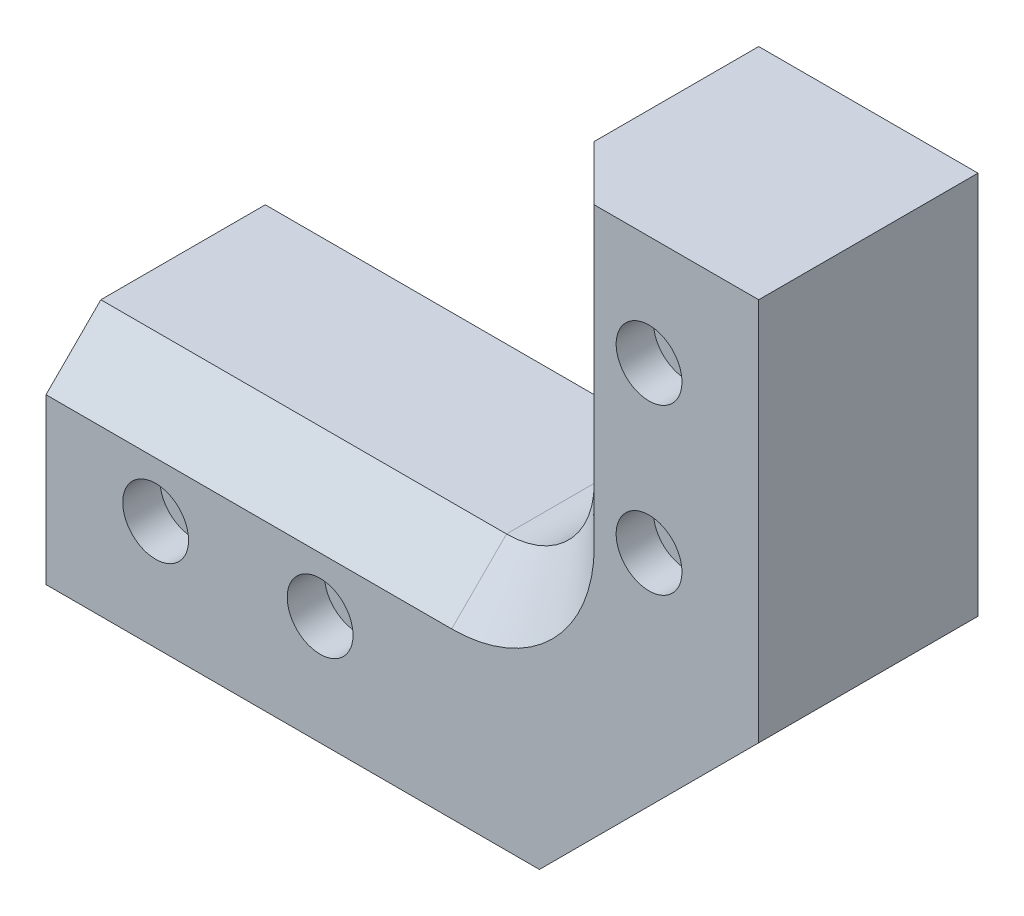
ISO-10303-21;
HEADER;
FILE_DESCRIPTION(('STEP AP214'),'2;1');
FILE_NAME('part.step','',(''),(''),'','','');
FILE_SCHEMA(('AUTOMOTIVE_DESIGN { 1 0 10303 214 1 1 1 1 }'));
ENDSEC;
DATA;
#1=APPLICATION_CONTEXT('core data for automotive mechanical design processes');
#2=APPLICATION_PROTOCOL_DEFINITION('international standard','automotive_design',2000,#1);
#3=PRODUCT_CONTEXT('',#1,'mechanical');
#4=PRODUCT('Part','Part','',(#3));
#5=PRODUCT_RELATED_PRODUCT_CATEGORY('part','',(#4));
#6=PRODUCT_DEFINITION_FORMATION('','',#4);
#7=PRODUCT_DEFINITION_CONTEXT('part definition',#1,'design');
#8=PRODUCT_DEFINITION('design','',#6,#7);
#9=PRODUCT_DEFINITION_SHAPE('','',#8);
#10=(LENGTH_UNIT() NAMED_UNIT(*) SI_UNIT(.MILLI.,.METRE.));
#11=(NAMED_UNIT(*) PLANE_ANGLE_UNIT() SI_UNIT($,.RADIAN.));
#12=(NAMED_UNIT(*) SI_UNIT($,.STERADIAN.) SOLID_ANGLE_UNIT());
#13=UNCERTAINTY_MEASURE_WITH_UNIT(LENGTH_MEASURE(1.E-05),#10,'distance_accuracy_value','');
#14=(GEOMETRIC_REPRESENTATION_CONTEXT(3) GLOBAL_UNCERTAINTY_ASSIGNED_CONTEXT((#13)) GLOBAL_UNIT_ASSIGNED_CONTEXT((#10,
#11,#12)) REPRESENTATION_CONTEXT('',''));
#15=CARTESIAN_POINT('',(0.,0.,0.));
#16=DIRECTION('',(0.,0.,1.));
#17=DIRECTION('',(1.,0.,0.));
#18=AXIS2_PLACEMENT_3D('',#15,#16,#17);
#19=CARTESIAN_POINT('',(0.,0.,20.));
#20=DIRECTION('',(0.,0.,-1.));
#21=DIRECTION('',(-1.,0.,0.));
#22=AXIS2_PLACEMENT_3D('',#19,#20,#21);
#23=PLANE('',#22);
#24=DIRECTION('',(-1.,0.,0.));
#25=VECTOR('',#24,1.);
#26=CARTESIAN_POINT('',(20.,35.,20.));
#27=LINE('',#26,#25);
#28=CARTESIAN_POINT('',(20.,35.,20.));
#29=VERTEX_POINT('',#28);
#30=CARTESIAN_POINT('',(5.,35.,20.));
#31=VERTEX_POINT('',#30);
#32=EDGE_CURVE('E155',#29,#31,#27,.T.);
#33=ORIENTED_EDGE('',*,*,#32,.T.);
#34=DIRECTION('',(0.,-1.,0.));
#35=VECTOR('',#34,1.);
#36=CARTESIAN_POINT('',(5.,0.,20.));
#37=LINE('',#36,#35);
#38=CARTESIAN_POINT('',(5.,8.,20.));
#39=VERTEX_POINT('',#38);
#40=EDGE_CURVE('E325',#31,#39,#37,.T.);
#41=ORIENTED_EDGE('',*,*,#40,.T.);
#42=CARTESIAN_POINT('',(-8.,8.,20.));
#43=DIRECTION('',(0.,0.,-1.));
#44=DIRECTION('',(-1.,0.,0.));
#45=AXIS2_PLACEMENT_3D('',#42,#43,#44);
#46=CIRCLE('',#45,13.);
#47=CARTESIAN_POINT('',(-8.,-5.,20.));
#48=VERTEX_POINT('',#47);
#49=EDGE_CURVE('E211',#39,#48,#46,.T.);
#50=ORIENTED_EDGE('',*,*,#49,.T.);
#51=DIRECTION('',(-1.,0.,0.));
#52=VECTOR('',#51,1.);
#53=CARTESIAN_POINT('',(0.,-5.,20.));
#54=LINE('',#53,#52);
#55=CARTESIAN_POINT('',(-45.,-5.,20.));
#56=VERTEX_POINT('',#55);
#57=EDGE_CURVE('E132',#48,#56,#54,.T.);
#58=ORIENTED_EDGE('',*,*,#57,.T.);
#59=DIRECTION('',(0.,-1.,0.));
#60=VECTOR('',#59,1.);
#61=CARTESIAN_POINT('',(-45.,0.,20.));
#62=LINE('',#61,#60);
#63=CARTESIAN_POINT('',(-45.,-20.,20.));
#64=VERTEX_POINT('',#63);
#65=EDGE_CURVE('E124',#56,#64,#62,.T.);
#66=ORIENTED_EDGE('',*,*,#65,.T.);
#67=DIRECTION('',(1.,0.,0.));
#68=VECTOR('',#67,1.);
#69=CARTESIAN_POINT('',(-45.,-20.,20.));
#70=LINE('',#69,#68);
#71=CARTESIAN_POINT('',(0.,-20.,20.));
#72=VERTEX_POINT('',#71);
#73=EDGE_CURVE('E129',#64,#72,#70,.T.);
#74=ORIENTED_EDGE('',*,*,#73,.T.);
#75=DIRECTION('',(-0.707106781186549,-0.707106781186546,0.));
#76=VECTOR('',#75,1.);
#77=CARTESIAN_POINT('',(20.,0.,20.));
#78=LINE('',#77,#76);
#79=CARTESIAN_POINT('',(20.,0.,20.));
#80=VERTEX_POINT('',#79);
#81=EDGE_CURVE('E208',#72,#80,#78,.F.);
#82=ORIENTED_EDGE('',*,*,#81,.T.);
#83=DIRECTION('',(0.,1.,0.));
#84=VECTOR('',#83,1.);
#85=CARTESIAN_POINT('',(20.,-20.,20.));
#86=LINE('',#85,#84);
#87=EDGE_CURVE('E152',#80,#29,#86,.T.);
#88=ORIENTED_EDGE('',*,*,#87,.T.);
#89=EDGE_LOOP('',(#33,#41,#50,#58,#66,#74,#82,#88));
#90=FACE_BOUND('',#89,.T.);
#91=CARTESIAN_POINT('',(-20.,-10.,20.));
#92=DIRECTION('',(0.,0.,1.));
#93=DIRECTION('',(1.,0.,0.));
#94=AXIS2_PLACEMENT_3D('',#91,#92,#93);
#95=CIRCLE('',#94,3.);
#96=CARTESIAN_POINT('',(-17.,-10.,20.));
#97=VERTEX_POINT('',#96);
#98=EDGE_CURVE('E381',#97,#97,#95,.T.);
#99=ORIENTED_EDGE('',*,*,#98,.F.);
#100=EDGE_LOOP('',(#99));
#101=FACE_BOUND('',#100,.T.);
#102=CARTESIAN_POINT('',(10.,25.,20.));
#103=DIRECTION('',(0.,0.,1.));
#104=DIRECTION('',(1.,0.,0.));
#105=AXIS2_PLACEMENT_3D('',#102,#103,#104);
#106=CIRCLE('',#105,3.);
#107=CARTESIAN_POINT('',(13.,25.,20.));
#108=VERTEX_POINT('',#107);
#109=EDGE_CURVE('E397',#108,#108,#106,.T.);
#110=ORIENTED_EDGE('',*,*,#109,.F.);
#111=EDGE_LOOP('',(#110));
#112=FACE_BOUND('',#111,.T.);
#113=CARTESIAN_POINT('',(10.,10.,20.));
#114=DIRECTION('',(0.,0.,1.));
#115=DIRECTION('',(1.,0.,0.));
#116=AXIS2_PLACEMENT_3D('',#113,#114,#115);
#117=CIRCLE('',#116,3.);
#118=CARTESIAN_POINT('',(13.,10.,20.));
#119=VERTEX_POINT('',#118);
#120=EDGE_CURVE('E413',#119,#119,#117,.T.);
#121=ORIENTED_EDGE('',*,*,#120,.F.);
#122=EDGE_LOOP('',(#121));
#123=FACE_BOUND('',#122,.T.);
#124=CARTESIAN_POINT('',(-35.,-10.,20.));
#125=DIRECTION('',(0.,0.,1.));
#126=DIRECTION('',(1.,0.,0.));
#127=AXIS2_PLACEMENT_3D('',#124,#125,#126);
#128=CIRCLE('',#127,3.);
#129=CARTESIAN_POINT('',(-32.,-10.,20.));
#130=VERTEX_POINT('',#129);
#131=EDGE_CURVE('E221',#130,#130,#128,.T.);
#132=ORIENTED_EDGE('',*,*,#131,.F.);
#133=EDGE_LOOP('',(#132));
#134=FACE_BOUND('',#133,.T.);
#135=ADVANCED_FACE('F45',(#90,#101,#112,#123,#134),#23,.F.);
#136=CARTESIAN_POINT('',(0.,35.,20.));
#137=DIRECTION('',(1.,0.,0.));
#138=DIRECTION('',(0.,0.,-1.));
#139=AXIS2_PLACEMENT_3D('',#136,#137,#138);
#140=PLANE('',#139);
#141=DIRECTION('',(0.,0.,-1.));
#142=VECTOR('',#141,1.);
#143=CARTESIAN_POINT('',(0.,8.,20.));
#144=LINE('',#143,#142);
#145=CARTESIAN_POINT('',(0.,8.,0.));
#146=VERTEX_POINT('',#145);
#147=CARTESIAN_POINT('',(0.,8.,15.));
#148=VERTEX_POINT('',#147);
#149=EDGE_CURVE('E192',#146,#148,#144,.F.);
#150=ORIENTED_EDGE('',*,*,#149,.T.);
#151=DIRECTION('',(0.,1.,0.));
#152=VECTOR('',#151,1.);
#153=CARTESIAN_POINT('',(0.,35.,15.));
#154=LINE('',#153,#152);
#155=CARTESIAN_POINT('',(0.,35.,15.));
#156=VERTEX_POINT('',#155);
#157=EDGE_CURVE('E311',#148,#156,#154,.T.);
#158=ORIENTED_EDGE('',*,*,#157,.T.);
#159=DIRECTION('',(0.,0.,-1.));
#160=VECTOR('',#159,1.);
#161=CARTESIAN_POINT('',(0.,35.,20.));
#162=LINE('',#161,#160);
#163=CARTESIAN_POINT('',(0.,35.,0.));
#164=VERTEX_POINT('',#163);
#165=EDGE_CURVE('E161',#156,#164,#162,.T.);
#166=ORIENTED_EDGE('',*,*,#165,.T.);
#167=DIRECTION('',(0.,-1.,0.));
#168=VECTOR('',#167,1.);
#169=CARTESIAN_POINT('',(0.,35.,0.));
#170=LINE('',#169,#168);
#171=EDGE_CURVE('E162',#164,#146,#170,.T.);
#172=ORIENTED_EDGE('',*,*,#171,.T.);
#173=EDGE_LOOP('',(#150,#158,#166,#172));
#174=FACE_BOUND('',#173,.T.);
#175=ADVANCED_FACE('F287',(#174),#140,.F.);
#176=CARTESIAN_POINT('',(0.,0.,20.));
#177=DIRECTION('',(0.,-1.,0.));
#178=DIRECTION('',(1.,0.,0.));
#179=AXIS2_PLACEMENT_3D('',#176,#177,#178);
#180=PLANE('',#179);
#181=DIRECTION('',(0.,0.,-1.));
#182=VECTOR('',#181,1.);
#183=CARTESIAN_POINT('',(-45.,0.,20.));
#184=LINE('',#183,#182);
#185=CARTESIAN_POINT('',(-45.,0.,15.));
#186=VERTEX_POINT('',#185);
#187=CARTESIAN_POINT('',(-45.,0.,0.));
#188=VERTEX_POINT('',#187);
#189=EDGE_CURVE('E145',#186,#188,#184,.T.);
#190=ORIENTED_EDGE('',*,*,#189,.F.);
#191=DIRECTION('',(1.,0.,0.));
#192=VECTOR('',#191,1.);
#193=CARTESIAN_POINT('',(0.,0.,15.));
#194=LINE('',#193,#192);
#195=CARTESIAN_POINT('',(-8.,0.,15.));
#196=VERTEX_POINT('',#195);
#197=EDGE_CURVE('E56',#186,#196,#194,.T.);
#198=ORIENTED_EDGE('',*,*,#197,.T.);
#199=DIRECTION('',(0.,0.,-1.));
#200=VECTOR('',#199,1.);
#201=CARTESIAN_POINT('',(-8.,0.,0.));
#202=LINE('',#201,#200);
#203=CARTESIAN_POINT('',(-7.99999999999999,0.,0.));
#204=VERTEX_POINT('',#203);
#205=EDGE_CURVE('E189',#196,#204,#202,.T.);
#206=ORIENTED_EDGE('',*,*,#205,.T.);
#207=DIRECTION('',(-1.,0.,0.));
#208=VECTOR('',#207,1.);
#209=CARTESIAN_POINT('',(0.,0.,0.));
#210=LINE('',#209,#208);
#211=EDGE_CURVE('E166',#204,#188,#210,.T.);
#212=ORIENTED_EDGE('',*,*,#211,.T.);
#213=EDGE_LOOP('',(#190,#198,#206,#212));
#214=FACE_BOUND('',#213,.T.);
#215=ADVANCED_FACE('F303',(#214),#180,.F.);
#216=CARTESIAN_POINT('',(-45.,0.,20.));
#217=DIRECTION('',(1.,0.,0.));
#218=DIRECTION('',(0.,1.,0.));
#219=AXIS2_PLACEMENT_3D('',#216,#217,#218);
#220=PLANE('',#219);
#221=ORIENTED_EDGE('',*,*,#65,.F.);
#222=DIRECTION('',(0.,-0.707106781186546,0.707106781186549));
#223=VECTOR('',#222,1.);
#224=CARTESIAN_POINT('',(-45.,-5.00000000000001,20.));
#225=LINE('',#224,#223);
#226=EDGE_CURVE('E71',#56,#186,#225,.F.);
#227=ORIENTED_EDGE('',*,*,#226,.T.);
#228=ORIENTED_EDGE('',*,*,#189,.T.);
#229=DIRECTION('',(0.,-1.,0.));
#230=VECTOR('',#229,1.);
#231=CARTESIAN_POINT('',(-45.,0.,0.));
#232=LINE('',#231,#230);
#233=CARTESIAN_POINT('',(-45.,-20.,0.));
#234=VERTEX_POINT('',#233);
#235=EDGE_CURVE('E140',#188,#234,#232,.T.);
#236=ORIENTED_EDGE('',*,*,#235,.T.);
#237=DIRECTION('',(0.,0.,-1.));
#238=VECTOR('',#237,1.);
#239=CARTESIAN_POINT('',(-45.,-20.,20.));
#240=LINE('',#239,#238);
#241=EDGE_CURVE('E137',#64,#234,#240,.T.);
#242=ORIENTED_EDGE('',*,*,#241,.F.);
#243=EDGE_LOOP('',(#221,#227,#228,#236,#242));
#244=FACE_BOUND('',#243,.T.);
#245=ADVANCED_FACE('F138',(#244),#220,.F.);
#246=CARTESIAN_POINT('',(-45.,-20.,20.));
#247=DIRECTION('',(0.,1.,0.));
#248=DIRECTION('',(-1.,0.,0.));
#249=AXIS2_PLACEMENT_3D('',#246,#247,#248);
#250=PLANE('',#249);
#251=DIRECTION('',(1.,0.,0.));
#252=VECTOR('',#251,1.);
#253=CARTESIAN_POINT('',(-45.,-20.,0.));
#254=LINE('',#253,#252);
#255=CARTESIAN_POINT('',(0.,-20.,0.));
#256=VERTEX_POINT('',#255);
#257=EDGE_CURVE('E173',#234,#256,#254,.T.);
#258=ORIENTED_EDGE('',*,*,#257,.T.);
#259=DIRECTION('',(0.,0.,1.));
#260=VECTOR('',#259,1.);
#261=CARTESIAN_POINT('',(0.,-20.,20.));
#262=LINE('',#261,#260);
#263=EDGE_CURVE('E150',#256,#72,#262,.T.);
#264=ORIENTED_EDGE('',*,*,#263,.T.);
#265=ORIENTED_EDGE('',*,*,#73,.F.);
#266=ORIENTED_EDGE('',*,*,#241,.T.);
#267=EDGE_LOOP('',(#258,#264,#265,#266));
#268=FACE_BOUND('',#267,.T.);
#269=ADVANCED_FACE('F148',(#268),#250,.F.);
#270=CARTESIAN_POINT('',(20.,-20.,20.));
#271=DIRECTION('',(-1.,0.,0.));
#272=DIRECTION('',(0.,-1.,0.));
#273=AXIS2_PLACEMENT_3D('',#270,#271,#272);
#274=PLANE('',#273);
#275=ORIENTED_EDGE('',*,*,#87,.F.);
#276=DIRECTION('',(0.,0.,-1.));
#277=VECTOR('',#276,1.);
#278=CARTESIAN_POINT('',(20.,0.,20.));
#279=LINE('',#278,#277);
#280=CARTESIAN_POINT('',(20.,0.,0.));
#281=VERTEX_POINT('',#280);
#282=EDGE_CURVE('E199',#80,#281,#279,.T.);
#283=ORIENTED_EDGE('',*,*,#282,.T.);
#284=DIRECTION('',(0.,1.,0.));
#285=VECTOR('',#284,1.);
#286=CARTESIAN_POINT('',(20.,-20.,0.));
#287=LINE('',#286,#285);
#288=CARTESIAN_POINT('',(20.,35.,0.));
#289=VERTEX_POINT('',#288);
#290=EDGE_CURVE('E176',#281,#289,#287,.T.);
#291=ORIENTED_EDGE('',*,*,#290,.T.);
#292=DIRECTION('',(0.,0.,-1.));
#293=VECTOR('',#292,1.);
#294=CARTESIAN_POINT('',(20.,35.,20.));
#295=LINE('',#294,#293);
#296=EDGE_CURVE('E146',#29,#289,#295,.T.);
#297=ORIENTED_EDGE('',*,*,#296,.F.);
#298=EDGE_LOOP('',(#275,#283,#291,#297));
#299=FACE_BOUND('',#298,.T.);
#300=ADVANCED_FACE('F294',(#299),#274,.F.);
#301=CARTESIAN_POINT('',(20.,35.,20.));
#302=DIRECTION('',(0.,-1.,0.));
#303=DIRECTION('',(0.,0.,-1.));
#304=AXIS2_PLACEMENT_3D('',#301,#302,#303);
#305=PLANE('',#304);
#306=ORIENTED_EDGE('',*,*,#165,.F.);
#307=DIRECTION('',(-0.707106781186546,0.,-0.707106781186549));
#308=VECTOR('',#307,1.);
#309=CARTESIAN_POINT('',(5.,35.,20.));
#310=LINE('',#309,#308);
#311=EDGE_CURVE('E323',#156,#31,#310,.F.);
#312=ORIENTED_EDGE('',*,*,#311,.T.);
#313=ORIENTED_EDGE('',*,*,#32,.F.);
#314=ORIENTED_EDGE('',*,*,#296,.T.);
#315=DIRECTION('',(-1.,0.,0.));
#316=VECTOR('',#315,1.);
#317=CARTESIAN_POINT('',(20.,35.,0.));
#318=LINE('',#317,#316);
#319=EDGE_CURVE('E134',#289,#164,#318,.T.);
#320=ORIENTED_EDGE('',*,*,#319,.T.);
#321=EDGE_LOOP('',(#306,#312,#313,#314,#320));
#322=FACE_BOUND('',#321,.T.);
#323=ADVANCED_FACE('F290',(#322),#305,.F.);
#324=CARTESIAN_POINT('',(0.,0.,0.));
#325=DIRECTION('',(0.,0.,-1.));
#326=DIRECTION('',(-1.,0.,0.));
#327=AXIS2_PLACEMENT_3D('',#324,#325,#326);
#328=PLANE('',#327);
#329=CARTESIAN_POINT('',(-35.,-10.,0.));
#330=DIRECTION('',(0.,0.,1.));
#331=DIRECTION('',(1.,0.,0.));
#332=AXIS2_PLACEMENT_3D('',#329,#330,#331);
#333=CIRCLE('',#332,1.6);
#334=CARTESIAN_POINT('',(-33.4,-10.,0.));
#335=VERTEX_POINT('',#334);
#336=EDGE_CURVE('E377',#335,#335,#333,.T.);
#337=ORIENTED_EDGE('',*,*,#336,.T.);
#338=EDGE_LOOP('',(#337));
#339=FACE_BOUND('',#338,.T.);
#340=CARTESIAN_POINT('',(-20.,-10.,0.));
#341=DIRECTION('',(0.,0.,1.));
#342=DIRECTION('',(1.,0.,0.));
#343=AXIS2_PLACEMENT_3D('',#340,#341,#342);
#344=CIRCLE('',#343,1.59999999999999);
#345=CARTESIAN_POINT('',(-18.4,-10.,0.));
#346=VERTEX_POINT('',#345);
#347=EDGE_CURVE('E393',#346,#346,#344,.T.);
#348=ORIENTED_EDGE('',*,*,#347,.T.);
#349=EDGE_LOOP('',(#348));
#350=FACE_BOUND('',#349,.T.);
#351=CARTESIAN_POINT('',(10.,25.,0.));
#352=DIRECTION('',(0.,0.,1.));
#353=DIRECTION('',(1.,0.,0.));
#354=AXIS2_PLACEMENT_3D('',#351,#352,#353);
#355=CIRCLE('',#354,1.6);
#356=CARTESIAN_POINT('',(11.6,25.,0.));
#357=VERTEX_POINT('',#356);
#358=EDGE_CURVE('E409',#357,#357,#355,.T.);
#359=ORIENTED_EDGE('',*,*,#358,.T.);
#360=EDGE_LOOP('',(#359));
#361=FACE_BOUND('',#360,.T.);
#362=CARTESIAN_POINT('',(10.,10.,0.));
#363=DIRECTION('',(0.,0.,1.));
#364=DIRECTION('',(1.,0.,0.));
#365=AXIS2_PLACEMENT_3D('',#362,#363,#364);
#366=CIRCLE('',#365,1.6);
#367=CARTESIAN_POINT('',(11.6,10.,0.));
#368=VERTEX_POINT('',#367);
#369=EDGE_CURVE('E167',#368,#368,#366,.T.);
#370=ORIENTED_EDGE('',*,*,#369,.T.);
#371=EDGE_LOOP('',(#370));
#372=FACE_BOUND('',#371,.T.);
#373=ORIENTED_EDGE('',*,*,#290,.F.);
#374=DIRECTION('',(0.707106781186549,0.707106781186546,0.));
#375=VECTOR('',#374,1.);
#376=CARTESIAN_POINT('',(9.99999999999996,-9.99999999999999,0.));
#377=LINE('',#376,#375);
#378=EDGE_CURVE('E203',#281,#256,#377,.F.);
#379=ORIENTED_EDGE('',*,*,#378,.T.);
#380=ORIENTED_EDGE('',*,*,#257,.F.);
#381=ORIENTED_EDGE('',*,*,#235,.F.);
#382=ORIENTED_EDGE('',*,*,#211,.F.);
#383=CARTESIAN_POINT('',(-8.,8.,0.));
#384=DIRECTION('',(0.,0.,-1.));
#385=DIRECTION('',(-1.,0.,0.));
#386=AXIS2_PLACEMENT_3D('',#383,#384,#385);
#387=CIRCLE('',#386,8.);
#388=EDGE_CURVE('E196',#204,#146,#387,.F.);
#389=ORIENTED_EDGE('',*,*,#388,.T.);
#390=ORIENTED_EDGE('',*,*,#171,.F.);
#391=ORIENTED_EDGE('',*,*,#319,.F.);
#392=EDGE_LOOP('',(#373,#379,#380,#381,#382,#389,#390,#391));
#393=FACE_BOUND('',#392,.T.);
#394=ADVANCED_FACE('F283',(#339,#350,#361,#372,#393),#328,.T.);
#395=CARTESIAN_POINT('',(10.,10.,20.));
#396=DIRECTION('',(0.,0.,1.));
#397=DIRECTION('',(1.,0.,0.));
#398=AXIS2_PLACEMENT_3D('',#395,#396,#397);
#399=CYLINDRICAL_SURFACE('',#398,1.6);
#400=ORIENTED_EDGE('',*,*,#369,.F.);
#401=EDGE_LOOP('',(#400));
#402=FACE_BOUND('',#401,.T.);
#403=CARTESIAN_POINT('',(10.,10.,16.6));
#404=DIRECTION('',(0.,0.,1.));
#405=DIRECTION('',(1.,0.,0.));
#406=AXIS2_PLACEMENT_3D('',#403,#404,#405);
#407=CIRCLE('',#406,1.6);
#408=CARTESIAN_POINT('',(11.6,10.,16.6));
#409=VERTEX_POINT('',#408);
#410=EDGE_CURVE('E421',#409,#409,#407,.T.);
#411=ORIENTED_EDGE('',*,*,#410,.T.);
#412=EDGE_LOOP('',(#411));
#413=FACE_BOUND('',#412,.T.);
#414=ADVANCED_FACE('F279',(#402,#413),#399,.F.);
#415=CARTESIAN_POINT('',(11.6,10.,16.6));
#416=DIRECTION('',(0.,0.,-1.));
#417=DIRECTION('',(-1.,0.,0.));
#418=AXIS2_PLACEMENT_3D('',#415,#416,#417);
#419=PLANE('',#418);
#420=ORIENTED_EDGE('',*,*,#410,.F.);
#421=EDGE_LOOP('',(#420));
#422=FACE_BOUND('',#421,.T.);
#423=CARTESIAN_POINT('',(10.,10.,16.6));
#424=DIRECTION('',(0.,0.,1.));
#425=DIRECTION('',(1.,0.,0.));
#426=AXIS2_PLACEMENT_3D('',#423,#424,#425);
#427=CIRCLE('',#426,3.);
#428=CARTESIAN_POINT('',(13.,10.,16.6));
#429=VERTEX_POINT('',#428);
#430=EDGE_CURVE('E417',#429,#429,#427,.T.);
#431=ORIENTED_EDGE('',*,*,#430,.T.);
#432=EDGE_LOOP('',(#431));
#433=FACE_BOUND('',#432,.T.);
#434=ADVANCED_FACE('F275',(#422,#433),#419,.F.);
#435=CARTESIAN_POINT('',(10.,10.,20.));
#436=DIRECTION('',(0.,0.,1.));
#437=DIRECTION('',(1.,0.,0.));
#438=AXIS2_PLACEMENT_3D('',#435,#436,#437);
#439=CYLINDRICAL_SURFACE('',#438,3.);
#440=ORIENTED_EDGE('',*,*,#430,.F.);
#441=EDGE_LOOP('',(#440));
#442=FACE_BOUND('',#441,.T.);
#443=ORIENTED_EDGE('',*,*,#120,.T.);
#444=EDGE_LOOP('',(#443));
#445=FACE_BOUND('',#444,.T.);
#446=ADVANCED_FACE('F271',(#442,#445),#439,.F.);
#447=CARTESIAN_POINT('',(10.,25.,20.));
#448=DIRECTION('',(0.,0.,1.));
#449=DIRECTION('',(1.,0.,0.));
#450=AXIS2_PLACEMENT_3D('',#447,#448,#449);
#451=CYLINDRICAL_SURFACE('',#450,1.6);
#452=ORIENTED_EDGE('',*,*,#358,.F.);
#453=EDGE_LOOP('',(#452));
#454=FACE_BOUND('',#453,.T.);
#455=CARTESIAN_POINT('',(10.,25.,16.6));
#456=DIRECTION('',(0.,0.,1.));
#457=DIRECTION('',(1.,0.,0.));
#458=AXIS2_PLACEMENT_3D('',#455,#456,#457);
#459=CIRCLE('',#458,1.6);
#460=CARTESIAN_POINT('',(11.6,25.,16.6));
#461=VERTEX_POINT('',#460);
#462=EDGE_CURVE('E405',#461,#461,#459,.T.);
#463=ORIENTED_EDGE('',*,*,#462,.T.);
#464=EDGE_LOOP('',(#463));
#465=FACE_BOUND('',#464,.T.);
#466=ADVANCED_FACE('F267',(#454,#465),#451,.F.);
#467=CARTESIAN_POINT('',(11.6,25.,16.6));
#468=DIRECTION('',(0.,0.,-1.));
#469=DIRECTION('',(-1.,0.,0.));
#470=AXIS2_PLACEMENT_3D('',#467,#468,#469);
#471=PLANE('',#470);
#472=ORIENTED_EDGE('',*,*,#462,.F.);
#473=EDGE_LOOP('',(#472));
#474=FACE_BOUND('',#473,.T.);
#475=CARTESIAN_POINT('',(10.,25.,16.6));
#476=DIRECTION('',(0.,0.,1.));
#477=DIRECTION('',(1.,0.,0.));
#478=AXIS2_PLACEMENT_3D('',#475,#476,#477);
#479=CIRCLE('',#478,3.);
#480=CARTESIAN_POINT('',(13.,25.,16.6));
#481=VERTEX_POINT('',#480);
#482=EDGE_CURVE('E401',#481,#481,#479,.T.);
#483=ORIENTED_EDGE('',*,*,#482,.T.);
#484=EDGE_LOOP('',(#483));
#485=FACE_BOUND('',#484,.T.);
#486=ADVANCED_FACE('F263',(#474,#485),#471,.F.);
#487=CARTESIAN_POINT('',(10.,25.,20.));
#488=DIRECTION('',(0.,0.,1.));
#489=DIRECTION('',(1.,0.,0.));
#490=AXIS2_PLACEMENT_3D('',#487,#488,#489);
#491=CYLINDRICAL_SURFACE('',#490,3.);
#492=ORIENTED_EDGE('',*,*,#482,.F.);
#493=EDGE_LOOP('',(#492));
#494=FACE_BOUND('',#493,.T.);
#495=ORIENTED_EDGE('',*,*,#109,.T.);
#496=EDGE_LOOP('',(#495));
#497=FACE_BOUND('',#496,.T.);
#498=ADVANCED_FACE('F259',(#494,#497),#491,.F.);
#499=CARTESIAN_POINT('',(-20.,-10.,20.));
#500=DIRECTION('',(0.,0.,1.));
#501=DIRECTION('',(1.,0.,0.));
#502=AXIS2_PLACEMENT_3D('',#499,#500,#501);
#503=CYLINDRICAL_SURFACE('',#502,1.6);
#504=ORIENTED_EDGE('',*,*,#347,.F.);
#505=EDGE_LOOP('',(#504));
#506=FACE_BOUND('',#505,.T.);
#507=CARTESIAN_POINT('',(-20.,-10.,16.6));
#508=DIRECTION('',(0.,0.,1.));
#509=DIRECTION('',(1.,0.,0.));
#510=AXIS2_PLACEMENT_3D('',#507,#508,#509);
#511=CIRCLE('',#510,1.6);
#512=CARTESIAN_POINT('',(-18.4,-10.,16.6));
#513=VERTEX_POINT('',#512);
#514=EDGE_CURVE('E389',#513,#513,#511,.T.);
#515=ORIENTED_EDGE('',*,*,#514,.T.);
#516=EDGE_LOOP('',(#515));
#517=FACE_BOUND('',#516,.T.);
#518=ADVANCED_FACE('F255',(#506,#517),#503,.F.);
#519=CARTESIAN_POINT('',(-18.4,-10.,16.6));
#520=DIRECTION('',(0.,0.,-1.));
#521=DIRECTION('',(-1.,0.,0.));
#522=AXIS2_PLACEMENT_3D('',#519,#520,#521);
#523=PLANE('',#522);
#524=ORIENTED_EDGE('',*,*,#514,.F.);
#525=EDGE_LOOP('',(#524));
#526=FACE_BOUND('',#525,.T.);
#527=CARTESIAN_POINT('',(-20.,-10.,16.6));
#528=DIRECTION('',(0.,0.,1.));
#529=DIRECTION('',(1.,0.,0.));
#530=AXIS2_PLACEMENT_3D('',#527,#528,#529);
#531=CIRCLE('',#530,3.);
#532=CARTESIAN_POINT('',(-17.,-10.,16.6));
#533=VERTEX_POINT('',#532);
#534=EDGE_CURVE('E385',#533,#533,#531,.T.);
#535=ORIENTED_EDGE('',*,*,#534,.T.);
#536=EDGE_LOOP('',(#535));
#537=FACE_BOUND('',#536,.T.);
#538=ADVANCED_FACE('F251',(#526,#537),#523,.F.);
#539=CARTESIAN_POINT('',(-20.,-10.,20.));
#540=DIRECTION('',(0.,0.,1.));
#541=DIRECTION('',(1.,0.,0.));
#542=AXIS2_PLACEMENT_3D('',#539,#540,#541);
#543=CYLINDRICAL_SURFACE('',#542,3.);
#544=ORIENTED_EDGE('',*,*,#534,.F.);
#545=EDGE_LOOP('',(#544));
#546=FACE_BOUND('',#545,.T.);
#547=ORIENTED_EDGE('',*,*,#98,.T.);
#548=EDGE_LOOP('',(#547));
#549=FACE_BOUND('',#548,.T.);
#550=ADVANCED_FACE('F247',(#546,#549),#543,.F.);
#551=CARTESIAN_POINT('',(-35.,-10.,20.));
#552=DIRECTION('',(0.,0.,1.));
#553=DIRECTION('',(1.,0.,0.));
#554=AXIS2_PLACEMENT_3D('',#551,#552,#553);
#555=CYLINDRICAL_SURFACE('',#554,1.6);
#556=ORIENTED_EDGE('',*,*,#336,.F.);
#557=EDGE_LOOP('',(#556));
#558=FACE_BOUND('',#557,.T.);
#559=CARTESIAN_POINT('',(-35.,-10.,16.6));
#560=DIRECTION('',(0.,0.,1.));
#561=DIRECTION('',(1.,0.,0.));
#562=AXIS2_PLACEMENT_3D('',#559,#560,#561);
#563=CIRCLE('',#562,1.6);
#564=CARTESIAN_POINT('',(-33.4,-10.,16.6));
#565=VERTEX_POINT('',#564);
#566=EDGE_CURVE('E373',#565,#565,#563,.T.);
#567=ORIENTED_EDGE('',*,*,#566,.T.);
#568=EDGE_LOOP('',(#567));
#569=FACE_BOUND('',#568,.T.);
#570=ADVANCED_FACE('F243',(#558,#569),#555,.F.);
#571=CARTESIAN_POINT('',(-33.4,-10.,16.6));
#572=DIRECTION('',(0.,0.,-1.));
#573=DIRECTION('',(-1.,0.,0.));
#574=AXIS2_PLACEMENT_3D('',#571,#572,#573);
#575=PLANE('',#574);
#576=ORIENTED_EDGE('',*,*,#566,.F.);
#577=EDGE_LOOP('',(#576));
#578=FACE_BOUND('',#577,.T.);
#579=CARTESIAN_POINT('',(-35.,-10.,16.6));
#580=DIRECTION('',(0.,0.,1.));
#581=DIRECTION('',(1.,0.,0.));
#582=AXIS2_PLACEMENT_3D('',#579,#580,#581);
#583=CIRCLE('',#582,3.);
#584=CARTESIAN_POINT('',(-32.,-10.,16.6));
#585=VERTEX_POINT('',#584);
#586=EDGE_CURVE('E369',#585,#585,#583,.T.);
#587=ORIENTED_EDGE('',*,*,#586,.T.);
#588=EDGE_LOOP('',(#587));
#589=FACE_BOUND('',#588,.T.);
#590=ADVANCED_FACE('F239',(#578,#589),#575,.F.);
#591=CARTESIAN_POINT('',(-35.,-10.,20.));
#592=DIRECTION('',(0.,0.,1.));
#593=DIRECTION('',(1.,0.,0.));
#594=AXIS2_PLACEMENT_3D('',#591,#592,#593);
#595=CYLINDRICAL_SURFACE('',#594,3.);
#596=ORIENTED_EDGE('',*,*,#586,.F.);
#597=EDGE_LOOP('',(#596));
#598=FACE_BOUND('',#597,.T.);
#599=ORIENTED_EDGE('',*,*,#131,.T.);
#600=EDGE_LOOP('',(#599));
#601=FACE_BOUND('',#600,.T.);
#602=ADVANCED_FACE('F236',(#598,#601),#595,.F.);
#603=CARTESIAN_POINT('',(-8.,8.,20.));
#604=DIRECTION('',(0.,0.,1.));
#605=DIRECTION('',(1.,0.,0.));
#606=AXIS2_PLACEMENT_3D('',#603,#604,#605);
#607=CYLINDRICAL_SURFACE('',#606,8.);
#608=CARTESIAN_POINT('',(-0.858686731982452,4.39422063791521,10.));
#609=CARTESIAN_POINT('',(-0.858686789926789,4.39421938856186,10.1366940722187));
#610=CARTESIAN_POINT('',(-0.864004649342805,4.38362974988802,10.2733975374064));
#611=CARTESIAN_POINT('',(-0.8853063245128,4.3419037904926,10.5427883217556));
#612=CARTESIAN_POINT('',(-0.901293022627274,4.31076191727543,10.6754745454643));
#613=CARTESIAN_POINT('',(-0.943983280399474,4.22976108127484,10.932889803864));
#614=CARTESIAN_POINT('',(-0.97066787993561,4.17993524253338,11.0576324662114));
#615=CARTESIAN_POINT('',(-1.03489467933821,4.06405284957794,11.296305391728));
#616=CARTESIAN_POINT('',(-1.0724387974404,3.99799342815875,11.4102337399202));
#617=CARTESIAN_POINT('',(-1.15987701434235,3.85026578144246,11.627957734987));
#618=CARTESIAN_POINT('',(-1.21011937474041,3.76817545278503,11.731327218872));
#619=CARTESIAN_POINT('',(-1.32236003007138,3.59319681969537,11.9211920264184));
#620=CARTESIAN_POINT('',(-1.38435996414138,3.50030701039439,12.0076849938897));
#621=CARTESIAN_POINT('',(-1.52140077244488,3.30508020890895,12.1632221260225));
#622=CARTESIAN_POINT('',(-1.59670487878777,3.20257706563735,12.2318274076629));
#623=CARTESIAN_POINT('',(-1.75846778929524,2.99393672970178,12.3467520997111));
#624=CARTESIAN_POINT('',(-1.84492396553888,2.88780039749263,12.3930767482992));
#625=CARTESIAN_POINT('',(-2.02447236033505,2.67915242598993,12.4607022561941));
#626=CARTESIAN_POINT('',(-2.11727731089,2.57663004173415,12.4827314995757));
#627=CARTESIAN_POINT('',(-2.30937889466637,2.37539668605388,12.503448692875));
#628=CARTESIAN_POINT('',(-2.4086740470891,2.27668485333602,12.5021419487176));
#629=CARTESIAN_POINT('',(-2.60718411641907,2.08937129033497,12.4767034168281));
#630=CARTESIAN_POINT('',(-2.70628344261371,2.00053816919031,12.453361232974));
#631=CARTESIAN_POINT('',(-2.90452947401386,1.831274137073,12.3858100199139));
#632=CARTESIAN_POINT('',(-3.00367618188798,1.75084377448849,12.3415996298267));
#633=CARTESIAN_POINT('',(-3.19993785317072,1.59882719148302,12.2330596218504));
#634=CARTESIAN_POINT('',(-3.29701309756395,1.52736126485836,12.1684903828745));
#635=CARTESIAN_POINT('',(-3.48453670175739,1.39517048209648,12.0212578005903));
#636=CARTESIAN_POINT('',(-3.57498337804559,1.33444834914898,11.9385898817222));
#637=CARTESIAN_POINT('',(-3.74958253994011,1.22171059122665,11.7534527303996));
#638=CARTESIAN_POINT('',(-3.83331563330142,1.17016326609624,11.6503018623258));
#639=CARTESIAN_POINT('',(-3.98658012148207,1.07898604955809,11.4292097963429));
#640=CARTESIAN_POINT('',(-4.05610984338815,1.03935756172537,11.3112668588193));
#641=CARTESIAN_POINT('',(-4.17836529356489,0.971481466801792,11.0621650623048));
#642=CARTESIAN_POINT('',(-4.23089444642132,0.943366061960876,10.9308731820181));
#643=CARTESIAN_POINT('',(-4.31513646501763,0.899008967474082,10.659881016316));
#644=CARTESIAN_POINT('',(-4.34685680967379,0.882763011577716,10.5201837716112));
#645=CARTESIAN_POINT('',(-4.38671152620111,0.862449321352277,10.2423600948457));
#646=CARTESIAN_POINT('',(-4.39574221573439,0.857918574897412,10.1043960075297));
#647=CARTESIAN_POINT('',(-4.39227992505271,0.859666525742974,9.82882051700972));
#648=CARTESIAN_POINT('',(-4.37979027062423,0.86594355279365,9.69120906260067));
#649=CARTESIAN_POINT('',(-4.33472495432974,0.888997187194954,9.42438340669516));
#650=CARTESIAN_POINT('',(-4.30274054927368,0.905464936699374,9.2950414518516));
#651=CARTESIAN_POINT('',(-4.22092559737634,0.948707688028034,9.04395641600833));
#652=CARTESIAN_POINT('',(-4.17109213990502,0.975484370974784,8.92221457815774));
#653=CARTESIAN_POINT('',(-4.05430132448762,1.0403997896425,8.68592178045639));
#654=CARTESIAN_POINT('',(-3.9868938673587,1.07884234744457,8.57167716881442));
#655=CARTESIAN_POINT('',(-3.83868072073826,1.16693033221927,8.3570193072762));
#656=CARTESIAN_POINT('',(-3.75787155140455,1.2165786700576,8.25660966214934));
#657=CARTESIAN_POINT('',(-3.5824650378382,1.32941650557292,8.06817926817437));
#658=CARTESIAN_POINT('',(-3.48743505512146,1.39308192631685,7.98084442772027));
#659=CARTESIAN_POINT('',(-3.2900479228939,1.53231751445809,7.8262179133575));
#660=CARTESIAN_POINT('',(-3.18769110926808,1.60788713631975,7.75892532137794));
#661=CARTESIAN_POINT('',(-2.98030892873462,1.76944365428925,7.64693887505665));
#662=CARTESIAN_POINT('',(-2.87530892399649,1.85534929730864,7.60208142431265));
#663=CARTESIAN_POINT('',(-2.66580540197887,2.03631842779679,7.5358549228206));
#664=CARTESIAN_POINT('',(-2.56130173953479,2.1313790393585,7.51447852183302));
#665=CARTESIAN_POINT('',(-2.36072004470887,2.32399309767805,7.49641799650077));
#666=CARTESIAN_POINT('',(-2.26447236269612,2.42127807697171,7.4987430996585));
#667=CARTESIAN_POINT('',(-2.07857043075207,2.61900711445247,7.5256236220974));
#668=CARTESIAN_POINT('',(-1.98891575134758,2.71945096625861,7.55017759198391));
#669=CARTESIAN_POINT('',(-1.81939058822888,2.9189561102239,7.62018801844456));
#670=CARTESIAN_POINT('',(-1.73941176094641,3.018018982591,7.66537921569075));
#671=CARTESIAN_POINT('',(-1.58925978085947,3.21277249710556,7.77514165441697));
#672=CARTESIAN_POINT('',(-1.51908831294453,3.30846255770259,7.83971621994687));
#673=CARTESIAN_POINT('',(-1.38705159076982,3.49638419741881,7.98894551668889));
#674=CARTESIAN_POINT('',(-1.32554879951344,3.58838838283814,8.07420704492796));
#675=CARTESIAN_POINT('',(-1.21402610675285,3.76193206768204,8.26131977888694));
#676=CARTESIAN_POINT('',(-1.1640096517796,3.84346842295562,8.36317594827878));
#677=CARTESIAN_POINT('',(-1.07396320444157,3.9952437990907,8.58463143968221));
#678=CARTESIAN_POINT('',(-1.03431897468645,4.06501902864176,8.70470680623316));
#679=CARTESIAN_POINT('',(-0.967107525209037,4.18643659337404,8.95679624053829));
#680=CARTESIAN_POINT('',(-0.939535420277329,4.23808626171749,9.08880545290051));
#681=CARTESIAN_POINT('',(-0.898134281311089,4.31688753475797,9.34944523462935));
#682=CARTESIAN_POINT('',(-0.883334338313141,4.3457517014293,9.47740509490314));
#683=CARTESIAN_POINT('',(-0.863611752503175,4.38441650584524,9.73690766419298));
#684=CARTESIAN_POINT('',(-0.858686676218457,4.39422184025761,9.868449482403));
#685=CARTESIAN_POINT('',(-0.858686731982452,4.39422063791521,10.));
#686=B_SPLINE_CURVE_WITH_KNOTS('',3,(#608,#609,#610,#611,#612,#613,#614,#615,#616,#617,#618,
#619,#620,#621,#622,#623,#624,#625,#626,#627,#628,#629,#630,#631,#632,#633,#634,#635,#636,#637,
#638,#639,#640,#641,#642,#643,#644,#645,#646,#647,#648,#649,#650,#651,#652,#653,#654,#655,#656,
#657,#658,#659,#660,#661,#662,#663,#664,#665,#666,#667,#668,#669,#670,#671,#672,#673,#674,#675,
#676,#677,#678,#679,#680,#681,#682,#683,#684,#685),.UNSPECIFIED.,.T.,.F.,(4,2,2,2,2,2,2,2,2,2,2,
2,2,2,2,2,2,2,2,2,2,2,2,2,2,2,2,2,2,2,2,2,2,2,2,2,2,2,4),(0.,0.409596275096977,
0.819303254119466,1.22828728823716,1.63734360984989,2.05914161101675,2.48099845882244,
2.91239643927465,3.34369294835842,3.76167445671065,4.17956092943547,4.58301965939499,
4.98650470380184,5.39492809216815,5.80345485426372,6.22900677874665,6.65460879707549,
7.0849694187114,7.51517527910366,7.92809866580731,8.34095824443039,8.74187944093586,
9.14286604511279,9.55535226624081,9.9679457602862,10.3976387562788,10.8273120663903,
11.2538047858685,11.6801639628603,12.0887760488391,12.4973614938947,12.9008369303438,
13.3043815982816,13.7216138621529,14.1389711554924,14.5701559100827,15.001166016125,
15.3954470874763,15.7896309838241),.UNSPECIFIED.);
#687=CARTESIAN_POINT('',(-0.858686731982452,4.39422063791521,10.));
#688=VERTEX_POINT('',#687);
#689=EDGE_CURVE('E212',#688,#688,#686,.T.);
#690=ORIENTED_EDGE('',*,*,#689,.T.);
#691=EDGE_LOOP('',(#690));
#692=FACE_BOUND('',#691,.T.);
#693=ORIENTED_EDGE('',*,*,#205,.F.);
#694=CARTESIAN_POINT('',(-8.,8.,15.));
#695=DIRECTION('',(0.,0.,-1.));
#696=DIRECTION('',(-1.,0.,0.));
#697=AXIS2_PLACEMENT_3D('',#694,#695,#696);
#698=CIRCLE('',#697,8.);
#699=EDGE_CURVE('E11',#196,#148,#698,.F.);
#700=ORIENTED_EDGE('',*,*,#699,.T.);
#701=ORIENTED_EDGE('',*,*,#149,.F.);
#702=ORIENTED_EDGE('',*,*,#388,.F.);
#703=EDGE_LOOP('',(#693,#700,#701,#702));
#704=FACE_BOUND('',#703,.T.);
#705=ADVANCED_FACE('F224',(#692,#704),#607,.F.);
#706=CARTESIAN_POINT('',(20.,0.,20.));
#707=DIRECTION('',(-0.707106781186546,0.707106781186549,0.));
#708=DIRECTION('',(0.,0.,-1.));
#709=AXIS2_PLACEMENT_3D('',#706,#707,#708);
#710=PLANE('',#709);
#711=CARTESIAN_POINT('',(9.99999999999996,-9.99999999999999,10.));
#712=DIRECTION('',(0.707106781186546,-0.707106781186549,0.));
#713=DIRECTION('',(0.707106781186549,0.707106781186546,0.));
#714=AXIS2_PLACEMENT_3D('',#711,#712,#713);
#715=CIRCLE('',#714,3.025);
#716=CARTESIAN_POINT('',(12.1389980130893,-7.86100198691069,10.));
#717=VERTEX_POINT('',#716);
#718=EDGE_CURVE('E334',#717,#717,#715,.T.);
#719=ORIENTED_EDGE('',*,*,#718,.F.);
#720=EDGE_LOOP('',(#719));
#721=FACE_BOUND('',#720,.T.);
#722=ORIENTED_EDGE('',*,*,#81,.F.);
#723=ORIENTED_EDGE('',*,*,#263,.F.);
#724=ORIENTED_EDGE('',*,*,#378,.F.);
#725=ORIENTED_EDGE('',*,*,#282,.F.);
#726=EDGE_LOOP('',(#722,#723,#724,#725));
#727=FACE_BOUND('',#726,.T.);
#728=ADVANCED_FACE('F234',(#721,#727),#710,.F.);
#729=CARTESIAN_POINT('',(9.99999999999996,-9.99999999999999,10.));
#730=DIRECTION('',(0.707106781186546,-0.707106781186549,0.));
#731=DIRECTION('',(0.707106781186549,0.707106781186546,0.));
#732=AXIS2_PLACEMENT_3D('',#729,#730,#731);
#733=CYLINDRICAL_SURFACE('',#732,2.49999999999999);
#734=CARTESIAN_POINT('',(9.62876893987701,-9.62876893987704,10.));
#735=DIRECTION('',(0.707106781186546,-0.707106781186549,0.));
#736=DIRECTION('',(0.707106781186549,0.707106781186546,0.));
#737=AXIS2_PLACEMENT_3D('',#734,#735,#736);
#738=CIRCLE('',#737,2.49999999999999);
#739=CARTESIAN_POINT('',(11.3965358928434,-7.86100198691069,10.));
#740=VERTEX_POINT('',#739);
#741=EDGE_CURVE('E222',#740,#740,#738,.T.);
#742=ORIENTED_EDGE('',*,*,#741,.T.);
#743=EDGE_LOOP('',(#742));
#744=FACE_BOUND('',#743,.T.);
#745=ORIENTED_EDGE('',*,*,#689,.F.);
#746=EDGE_LOOP('',(#745));
#747=FACE_BOUND('',#746,.T.);
#748=ADVANCED_FACE('F228',(#744,#747),#733,.F.);
#749=CARTESIAN_POINT('',(9.99999999999996,-9.99999999999999,10.));
#750=DIRECTION('',(0.707106781186546,-0.707106781186549,0.));
#751=DIRECTION('',(0.707106781186549,0.707106781186546,0.));
#752=AXIS2_PLACEMENT_3D('',#749,#750,#751);
#753=CONICAL_SURFACE('',#752,3.025,0.785398163397445);
#754=ORIENTED_EDGE('',*,*,#741,.F.);
#755=EDGE_LOOP('',(#754));
#756=FACE_BOUND('',#755,.T.);
#757=ORIENTED_EDGE('',*,*,#718,.T.);
#758=EDGE_LOOP('',(#757));
#759=FACE_BOUND('',#758,.T.);
#760=ADVANCED_FACE('F233',(#756,#759),#753,.F.);
#761=CARTESIAN_POINT('',(0.,-5.,20.));
#762=DIRECTION('',(0.,-0.707106781186549,-0.707106781186546));
#763=DIRECTION('',(-1.,0.,0.));
#764=AXIS2_PLACEMENT_3D('',#761,#762,#763);
#765=PLANE('',#764);
#766=ORIENTED_EDGE('',*,*,#226,.F.);
#767=ORIENTED_EDGE('',*,*,#57,.F.);
#768=DIRECTION('',(0.,-0.707106781186546,0.707106781186549));
#769=VECTOR('',#768,1.);
#770=CARTESIAN_POINT('',(-8.,0.,15.));
#771=LINE('',#770,#769);
#772=EDGE_CURVE('E50',#196,#48,#771,.T.);
#773=ORIENTED_EDGE('',*,*,#772,.F.);
#774=ORIENTED_EDGE('',*,*,#197,.F.);
#775=EDGE_LOOP('',(#766,#767,#773,#774));
#776=FACE_BOUND('',#775,.T.);
#777=ADVANCED_FACE('F48',(#776),#765,.F.);
#778=CARTESIAN_POINT('',(-8.,8.,20.));
#779=DIRECTION('',(0.,0.,1.));
#780=DIRECTION('',(1.,0.,0.));
#781=AXIS2_PLACEMENT_3D('',#778,#779,#780);
#782=CONICAL_SURFACE('',#781,13.,0.785398163397446);
#783=ORIENTED_EDGE('',*,*,#772,.T.);
#784=ORIENTED_EDGE('',*,*,#49,.F.);
#785=DIRECTION('',(0.707106781186546,0.,0.707106781186549));
#786=VECTOR('',#785,1.);
#787=CARTESIAN_POINT('',(0.,8.,15.));
#788=LINE('',#787,#786);
#789=EDGE_CURVE('E321',#148,#39,#788,.T.);
#790=ORIENTED_EDGE('',*,*,#789,.F.);
#791=ORIENTED_EDGE('',*,*,#699,.F.);
#792=EDGE_LOOP('',(#783,#784,#790,#791));
#793=FACE_BOUND('',#792,.T.);
#794=ADVANCED_FACE('F330',(#793),#782,.F.);
#795=CARTESIAN_POINT('',(5.,0.,20.));
#796=DIRECTION('',(0.707106781186549,0.,-0.707106781186546));
#797=DIRECTION('',(0.,-1.,0.));
#798=AXIS2_PLACEMENT_3D('',#795,#796,#797);
#799=PLANE('',#798);
#800=ORIENTED_EDGE('',*,*,#311,.F.);
#801=ORIENTED_EDGE('',*,*,#157,.F.);
#802=ORIENTED_EDGE('',*,*,#789,.T.);
#803=ORIENTED_EDGE('',*,*,#40,.F.);
#804=EDGE_LOOP('',(#800,#801,#802,#803));
#805=FACE_BOUND('',#804,.T.);
#806=ADVANCED_FACE('F319',(#805),#799,.F.);
#807=CLOSED_SHELL('',(#135,#175,#215,#245,#269,#300,#323,#394,#414,#434,#446,#466,#486,#498,
#518,#538,#550,#570,#590,#602,#705,#728,#748,#760,#777,#794,#806));
#808=MANIFOLD_SOLID_BREP('B2',#807);
#809=ADVANCED_BREP_SHAPE_REPRESENTATION('',(#18,#808),#14);
#810=SHAPE_DEFINITION_REPRESENTATION(#9,#809);
ENDSEC;
END-ISO-10303-21;
